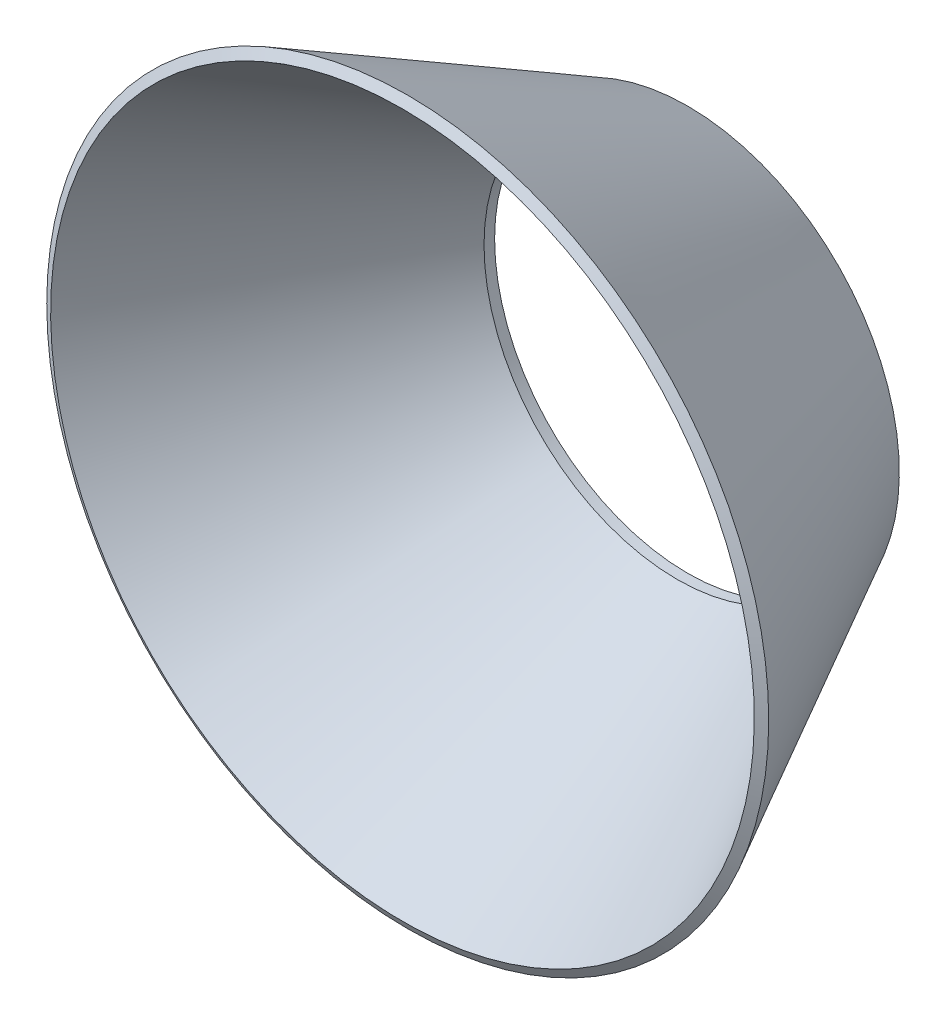
ISO-10303-21;
HEADER;
FILE_DESCRIPTION(('STEP AP214'),'2;1');
FILE_NAME('part.step','',(''),(''),'','','');
FILE_SCHEMA(('AUTOMOTIVE_DESIGN { 1 0 10303 214 1 1 1 1 }'));
ENDSEC;
DATA;
#1=APPLICATION_CONTEXT('core data for automotive mechanical design processes');
#2=APPLICATION_PROTOCOL_DEFINITION('international standard','automotive_design',2000,#1);
#3=PRODUCT_CONTEXT('',#1,'mechanical');
#4=PRODUCT('Part','Part','',(#3));
#5=PRODUCT_RELATED_PRODUCT_CATEGORY('part','',(#4));
#6=PRODUCT_DEFINITION_FORMATION('','',#4);
#7=PRODUCT_DEFINITION_CONTEXT('part definition',#1,'design');
#8=PRODUCT_DEFINITION('design','',#6,#7);
#9=PRODUCT_DEFINITION_SHAPE('','',#8);
#10=(LENGTH_UNIT() NAMED_UNIT(*) SI_UNIT(.MILLI.,.METRE.));
#11=(NAMED_UNIT(*) PLANE_ANGLE_UNIT() SI_UNIT($,.RADIAN.));
#12=(NAMED_UNIT(*) SI_UNIT($,.STERADIAN.) SOLID_ANGLE_UNIT());
#13=UNCERTAINTY_MEASURE_WITH_UNIT(LENGTH_MEASURE(1.E-05),#10,'distance_accuracy_value','');
#14=(GEOMETRIC_REPRESENTATION_CONTEXT(3) GLOBAL_UNCERTAINTY_ASSIGNED_CONTEXT((#13)) GLOBAL_UNIT_ASSIGNED_CONTEXT((#10,
#11,#12)) REPRESENTATION_CONTEXT('',''));
#15=CARTESIAN_POINT('',(0.,0.,0.));
#16=DIRECTION('',(0.,0.,1.));
#17=DIRECTION('',(1.,0.,0.));
#18=AXIS2_PLACEMENT_3D('',#15,#16,#17);
#19=CARTESIAN_POINT('',(0.,0.,71.3397459621556));
#20=DIRECTION('',(0.,0.,1.));
#21=DIRECTION('',(0.,-1.,0.));
#22=AXIS2_PLACEMENT_3D('',#19,#20,#21);
#23=CONICAL_SURFACE('',#22,80.,0.490277779720056);
#24=CARTESIAN_POINT('',(0.,0.,177.262794416288));
#25=DIRECTION('',(0.,0.,-1.));
#26=DIRECTION('',(0.,1.,0.));
#27=AXIS2_PLACEMENT_3D('',#24,#25,#26);
#28=CIRCLE('',#27,136.535898384863);
#29=CARTESIAN_POINT('',(0.,136.535898384863,177.262794416288));
#30=VERTEX_POINT('',#29);
#31=EDGE_CURVE('E51',#30,#30,#28,.T.);
#32=ORIENTED_EDGE('',*,*,#31,.T.);
#33=EDGE_LOOP('',(#32));
#34=FACE_BOUND('',#33,.T.);
#35=CARTESIAN_POINT('',(0.,0.,71.3397459621556));
#36=DIRECTION('',(0.,0.,-1.));
#37=DIRECTION('',(0.,1.,0.));
#38=AXIS2_PLACEMENT_3D('',#35,#36,#37);
#39=CIRCLE('',#38,80.);
#40=CARTESIAN_POINT('',(0.,80.,71.3397459621556));
#41=VERTEX_POINT('',#40);
#42=EDGE_CURVE('E10',#41,#41,#39,.T.);
#43=ORIENTED_EDGE('',*,*,#42,.F.);
#44=EDGE_LOOP('',(#43));
#45=FACE_BOUND('',#44,.T.);
#46=ADVANCED_FACE('F45',(#34,#45),#23,.T.);
#47=CARTESIAN_POINT('',(0.,0.,179.262794416288));
#48=DIRECTION('',(0.,0.,-1.));
#49=DIRECTION('',(0.,1.,0.));
#50=AXIS2_PLACEMENT_3D('',#47,#48,#49);
#51=CONICAL_SURFACE('',#50,133.071796769725,1.0471975511966);
#52=ORIENTED_EDGE('',*,*,#31,.F.);
#53=EDGE_LOOP('',(#52));
#54=FACE_BOUND('',#53,.T.);
#55=CARTESIAN_POINT('',(0.,0.,179.262794416288));
#56=DIRECTION('',(0.,0.,-1.));
#57=DIRECTION('',(0.,1.,0.));
#58=AXIS2_PLACEMENT_3D('',#55,#56,#57);
#59=CIRCLE('',#58,133.071796769725);
#60=CARTESIAN_POINT('',(0.,133.071796769725,179.262794416288));
#61=VERTEX_POINT('',#60);
#62=EDGE_CURVE('E55',#61,#61,#59,.T.);
#63=ORIENTED_EDGE('',*,*,#62,.T.);
#64=EDGE_LOOP('',(#63));
#65=FACE_BOUND('',#64,.T.);
#66=ADVANCED_FACE('F80',(#54,#65),#51,.T.);
#67=CARTESIAN_POINT('',(0.,0.,75.3397459621556));
#68=DIRECTION('',(0.,0.,1.));
#69=DIRECTION('',(0.,-1.,0.));
#70=AXIS2_PLACEMENT_3D('',#67,#68,#69);
#71=CONICAL_SURFACE('',#70,73.0717967697245,0.523598775598304);
#72=ORIENTED_EDGE('',*,*,#62,.F.);
#73=EDGE_LOOP('',(#72));
#74=FACE_BOUND('',#73,.T.);
#75=CARTESIAN_POINT('',(0.,0.,75.3397459621556));
#76=DIRECTION('',(0.,0.,-1.));
#77=DIRECTION('',(0.,1.,0.));
#78=AXIS2_PLACEMENT_3D('',#75,#76,#77);
#79=CIRCLE('',#78,73.0717967697245);
#80=CARTESIAN_POINT('',(0.,73.0717967697245,75.3397459621556));
#81=VERTEX_POINT('',#80);
#82=EDGE_CURVE('E59',#81,#81,#79,.F.);
#83=ORIENTED_EDGE('',*,*,#82,.F.);
#84=EDGE_LOOP('',(#83));
#85=FACE_BOUND('',#84,.T.);
#86=ADVANCED_FACE('F72',(#74,#85),#71,.F.);
#87=CARTESIAN_POINT('',(0.,0.,71.3397459621556));
#88=DIRECTION('',(0.,0.,-1.));
#89=DIRECTION('',(0.,1.,0.));
#90=AXIS2_PLACEMENT_3D('',#87,#88,#89);
#91=PLANE('',#90);
#92=CARTESIAN_POINT('',(0.,0.,71.3397459621556));
#93=DIRECTION('',(0.,0.,-1.));
#94=DIRECTION('',(0.,1.,0.));
#95=AXIS2_PLACEMENT_3D('',#92,#93,#94);
#96=CIRCLE('',#95,73.0717967697245);
#97=CARTESIAN_POINT('',(0.,73.0717967697245,71.3397459621556));
#98=VERTEX_POINT('',#97);
#99=EDGE_CURVE('E64',#98,#98,#96,.T.);
#100=ORIENTED_EDGE('',*,*,#99,.F.);
#101=EDGE_LOOP('',(#100));
#102=FACE_BOUND('',#101,.T.);
#103=ORIENTED_EDGE('',*,*,#42,.T.);
#104=EDGE_LOOP('',(#103));
#105=FACE_BOUND('',#104,.T.);
#106=ADVANCED_FACE('F70',(#102,#105),#91,.T.);
#107=CARTESIAN_POINT('',(0.,0.,301.613915941851));
#108=DIRECTION('',(0.,0.,-1.));
#109=DIRECTION('',(0.,1.,0.));
#110=AXIS2_PLACEMENT_3D('',#107,#108,#109);
#111=CYLINDRICAL_SURFACE('',#110,73.0717967697245);
#112=ORIENTED_EDGE('',*,*,#82,.T.);
#113=EDGE_LOOP('',(#112));
#114=FACE_BOUND('',#113,.T.);
#115=ORIENTED_EDGE('',*,*,#99,.T.);
#116=EDGE_LOOP('',(#115));
#117=FACE_BOUND('',#116,.T.);
#118=ADVANCED_FACE('F68',(#114,#117),#111,.F.);
#119=CLOSED_SHELL('',(#46,#66,#86,#106,#118));
#120=MANIFOLD_SOLID_BREP('B2',#119);
#121=ADVANCED_BREP_SHAPE_REPRESENTATION('',(#18,#120),#14);
#122=SHAPE_DEFINITION_REPRESENTATION(#9,#121);
ENDSEC;
END-ISO-10303-21;
